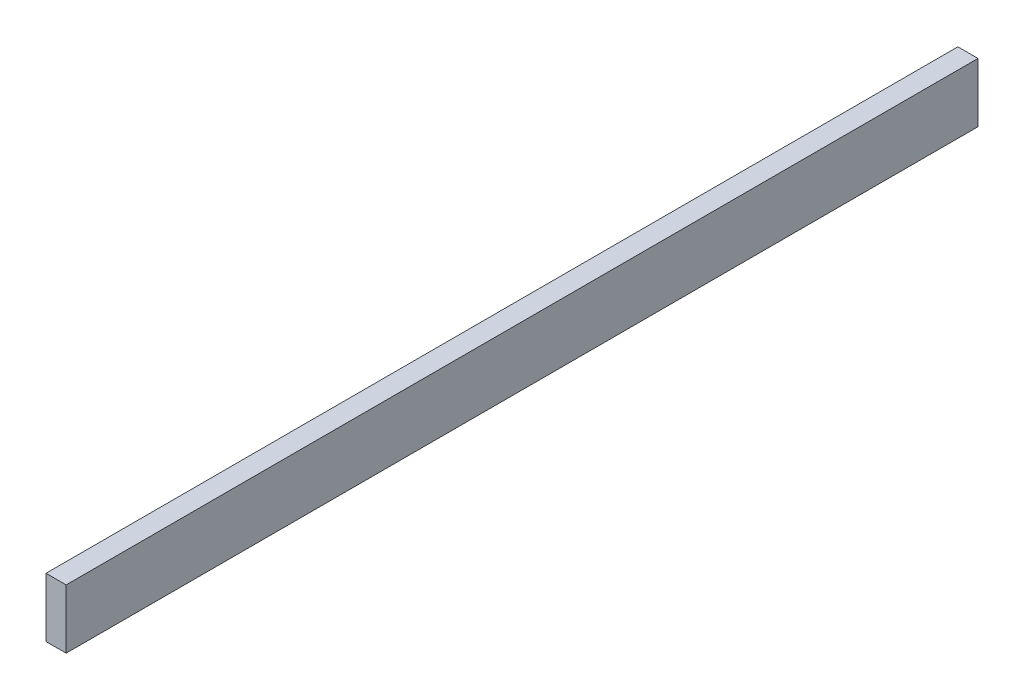
ISO-10303-21;
HEADER;
FILE_DESCRIPTION(('STEP AP214'),'2;1');
FILE_NAME('part.step','',(''),(''),'','','');
FILE_SCHEMA(('AUTOMOTIVE_DESIGN { 1 0 10303 214 1 1 1 1 }'));
ENDSEC;
DATA;
#1=APPLICATION_CONTEXT('core data for automotive mechanical design processes');
#2=APPLICATION_PROTOCOL_DEFINITION('international standard','automotive_design',2000,#1);
#3=PRODUCT_CONTEXT('',#1,'mechanical');
#4=PRODUCT('Part','Part','',(#3));
#5=PRODUCT_RELATED_PRODUCT_CATEGORY('part','',(#4));
#6=PRODUCT_DEFINITION_FORMATION('','',#4);
#7=PRODUCT_DEFINITION_CONTEXT('part definition',#1,'design');
#8=PRODUCT_DEFINITION('design','',#6,#7);
#9=PRODUCT_DEFINITION_SHAPE('','',#8);
#10=(LENGTH_UNIT() NAMED_UNIT(*) SI_UNIT(.MILLI.,.METRE.));
#11=(NAMED_UNIT(*) PLANE_ANGLE_UNIT() SI_UNIT($,.RADIAN.));
#12=(NAMED_UNIT(*) SI_UNIT($,.STERADIAN.) SOLID_ANGLE_UNIT());
#13=UNCERTAINTY_MEASURE_WITH_UNIT(LENGTH_MEASURE(1.E-05),#10,'distance_accuracy_value','');
#14=(GEOMETRIC_REPRESENTATION_CONTEXT(3) GLOBAL_UNCERTAINTY_ASSIGNED_CONTEXT((#13)) GLOBAL_UNIT_ASSIGNED_CONTEXT((#10,
#11,#12)) REPRESENTATION_CONTEXT('',''));
#15=CARTESIAN_POINT('',(0.,0.,0.));
#16=DIRECTION('',(0.,0.,1.));
#17=DIRECTION('',(1.,0.,0.));
#18=AXIS2_PLACEMENT_3D('',#15,#16,#17);
#19=CARTESIAN_POINT('',(-10.16,29.845,920.117999994));
#20=DIRECTION('',(1.,0.,0.));
#21=DIRECTION('',(0.,1.,0.));
#22=AXIS2_PLACEMENT_3D('',#19,#20,#21);
#23=PLANE('',#22);
#24=DIRECTION('',(0.,-1.,0.));
#25=VECTOR('',#24,1.);
#26=CARTESIAN_POINT('',(-10.16,29.845,0.));
#27=LINE('',#26,#25);
#28=CARTESIAN_POINT('',(-10.16,29.845,0.));
#29=VERTEX_POINT('',#28);
#30=CARTESIAN_POINT('',(-10.16,-29.845,0.));
#31=VERTEX_POINT('',#30);
#32=EDGE_CURVE('E96',#29,#31,#27,.T.);
#33=ORIENTED_EDGE('',*,*,#32,.T.);
#34=DIRECTION('',(0.,0.,-1.));
#35=VECTOR('',#34,1.);
#36=CARTESIAN_POINT('',(-10.16,-29.845,920.117999994));
#37=LINE('',#36,#35);
#38=CARTESIAN_POINT('',(-10.16,-29.845,920.117999994));
#39=VERTEX_POINT('',#38);
#40=EDGE_CURVE('E11',#39,#31,#37,.T.);
#41=ORIENTED_EDGE('',*,*,#40,.F.);
#42=DIRECTION('',(0.,-1.,0.));
#43=VECTOR('',#42,1.);
#44=CARTESIAN_POINT('',(-10.16,29.845,920.117999994));
#45=LINE('',#44,#43);
#46=CARTESIAN_POINT('',(-10.16,29.845,920.117999994));
#47=VERTEX_POINT('',#46);
#48=EDGE_CURVE('E84',#47,#39,#45,.T.);
#49=ORIENTED_EDGE('',*,*,#48,.F.);
#50=DIRECTION('',(0.,0.,-1.));
#51=VECTOR('',#50,1.);
#52=CARTESIAN_POINT('',(-10.16,29.845,920.117999994));
#53=LINE('',#52,#51);
#54=EDGE_CURVE('E92',#47,#29,#53,.T.);
#55=ORIENTED_EDGE('',*,*,#54,.T.);
#56=EDGE_LOOP('',(#33,#41,#49,#55));
#57=FACE_BOUND('',#56,.T.);
#58=ADVANCED_FACE('F33',(#57),#23,.F.);
#59=CARTESIAN_POINT('',(10.16,-29.845,920.117999994));
#60=DIRECTION('',(0.,1.,0.));
#61=DIRECTION('',(0.,0.,1.));
#62=AXIS2_PLACEMENT_3D('',#59,#60,#61);
#63=PLANE('',#62);
#64=DIRECTION('',(1.,0.,0.));
#65=VECTOR('',#64,1.);
#66=CARTESIAN_POINT('',(10.16,-29.845,0.));
#67=LINE('',#66,#65);
#68=CARTESIAN_POINT('',(10.16,-29.845,0.));
#69=VERTEX_POINT('',#68);
#70=EDGE_CURVE('E88',#31,#69,#67,.T.);
#71=ORIENTED_EDGE('',*,*,#70,.T.);
#72=DIRECTION('',(0.,0.,-1.));
#73=VECTOR('',#72,1.);
#74=CARTESIAN_POINT('',(10.16,-29.845,920.117999994));
#75=LINE('',#74,#73);
#76=CARTESIAN_POINT('',(10.16,-29.845,920.117999994));
#77=VERTEX_POINT('',#76);
#78=EDGE_CURVE('E41',#77,#69,#75,.T.);
#79=ORIENTED_EDGE('',*,*,#78,.F.);
#80=DIRECTION('',(1.,0.,0.));
#81=VECTOR('',#80,1.);
#82=CARTESIAN_POINT('',(10.16,-29.845,920.117999994));
#83=LINE('',#82,#81);
#84=EDGE_CURVE('E79',#39,#77,#83,.T.);
#85=ORIENTED_EDGE('',*,*,#84,.F.);
#86=ORIENTED_EDGE('',*,*,#40,.T.);
#87=EDGE_LOOP('',(#71,#79,#85,#86));
#88=FACE_BOUND('',#87,.T.);
#89=ADVANCED_FACE('F87',(#88),#63,.F.);
#90=CARTESIAN_POINT('',(10.16,29.845,920.117999994));
#91=DIRECTION('',(-1.,0.,0.));
#92=DIRECTION('',(0.,-1.,0.));
#93=AXIS2_PLACEMENT_3D('',#90,#91,#92);
#94=PLANE('',#93);
#95=DIRECTION('',(0.,1.,0.));
#96=VECTOR('',#95,1.);
#97=CARTESIAN_POINT('',(10.16,29.845,0.));
#98=LINE('',#97,#96);
#99=CARTESIAN_POINT('',(10.16,29.845,0.));
#100=VERTEX_POINT('',#99);
#101=EDGE_CURVE('E66',#69,#100,#98,.T.);
#102=ORIENTED_EDGE('',*,*,#101,.T.);
#103=DIRECTION('',(0.,0.,-1.));
#104=VECTOR('',#103,1.);
#105=CARTESIAN_POINT('',(10.16,29.845,920.117999994));
#106=LINE('',#105,#104);
#107=CARTESIAN_POINT('',(10.16,29.845,920.117999994));
#108=VERTEX_POINT('',#107);
#109=EDGE_CURVE('E89',#108,#100,#106,.T.);
#110=ORIENTED_EDGE('',*,*,#109,.F.);
#111=DIRECTION('',(0.,1.,0.));
#112=VECTOR('',#111,1.);
#113=CARTESIAN_POINT('',(10.16,29.845,920.117999994));
#114=LINE('',#113,#112);
#115=EDGE_CURVE('E82',#77,#108,#114,.T.);
#116=ORIENTED_EDGE('',*,*,#115,.F.);
#117=ORIENTED_EDGE('',*,*,#78,.T.);
#118=EDGE_LOOP('',(#102,#110,#116,#117));
#119=FACE_BOUND('',#118,.T.);
#120=ADVANCED_FACE('F90',(#119),#94,.F.);
#121=CARTESIAN_POINT('',(10.16,29.845,920.117999994));
#122=DIRECTION('',(0.,-1.,0.));
#123=DIRECTION('',(1.,0.,0.));
#124=AXIS2_PLACEMENT_3D('',#121,#122,#123);
#125=PLANE('',#124);
#126=DIRECTION('',(-1.,0.,0.));
#127=VECTOR('',#126,1.);
#128=CARTESIAN_POINT('',(10.16,29.845,0.));
#129=LINE('',#128,#127);
#130=EDGE_CURVE('E72',#100,#29,#129,.T.);
#131=ORIENTED_EDGE('',*,*,#130,.T.);
#132=ORIENTED_EDGE('',*,*,#54,.F.);
#133=DIRECTION('',(-1.,0.,0.));
#134=VECTOR('',#133,1.);
#135=CARTESIAN_POINT('',(10.16,29.845,920.117999994));
#136=LINE('',#135,#134);
#137=EDGE_CURVE('E49',#108,#47,#136,.T.);
#138=ORIENTED_EDGE('',*,*,#137,.F.);
#139=ORIENTED_EDGE('',*,*,#109,.T.);
#140=EDGE_LOOP('',(#131,#132,#138,#139));
#141=FACE_BOUND('',#140,.T.);
#142=ADVANCED_FACE('F103',(#141),#125,.F.);
#143=CARTESIAN_POINT('',(0.,0.,920.117999994));
#144=DIRECTION('',(0.,0.,-1.));
#145=DIRECTION('',(-1.,0.,0.));
#146=AXIS2_PLACEMENT_3D('',#143,#144,#145);
#147=PLANE('',#146);
#148=ORIENTED_EDGE('',*,*,#48,.T.);
#149=ORIENTED_EDGE('',*,*,#84,.T.);
#150=ORIENTED_EDGE('',*,*,#115,.T.);
#151=ORIENTED_EDGE('',*,*,#137,.T.);
#152=EDGE_LOOP('',(#148,#149,#150,#151));
#153=FACE_BOUND('',#152,.T.);
#154=ADVANCED_FACE('F80',(#153),#147,.F.);
#155=CARTESIAN_POINT('',(0.,0.,0.));
#156=DIRECTION('',(0.,0.,-1.));
#157=DIRECTION('',(-1.,0.,0.));
#158=AXIS2_PLACEMENT_3D('',#155,#156,#157);
#159=PLANE('',#158);
#160=ORIENTED_EDGE('',*,*,#32,.F.);
#161=ORIENTED_EDGE('',*,*,#130,.F.);
#162=ORIENTED_EDGE('',*,*,#101,.F.);
#163=ORIENTED_EDGE('',*,*,#70,.F.);
#164=EDGE_LOOP('',(#160,#161,#162,#163));
#165=FACE_BOUND('',#164,.T.);
#166=ADVANCED_FACE('F106',(#165),#159,.T.);
#167=CLOSED_SHELL('',(#58,#89,#120,#142,#154,#166));
#168=MANIFOLD_SOLID_BREP('B2',#167);
#169=ADVANCED_BREP_SHAPE_REPRESENTATION('',(#18,#168),#14);
#170=SHAPE_DEFINITION_REPRESENTATION(#9,#169);
ENDSEC;
END-ISO-10303-21;
